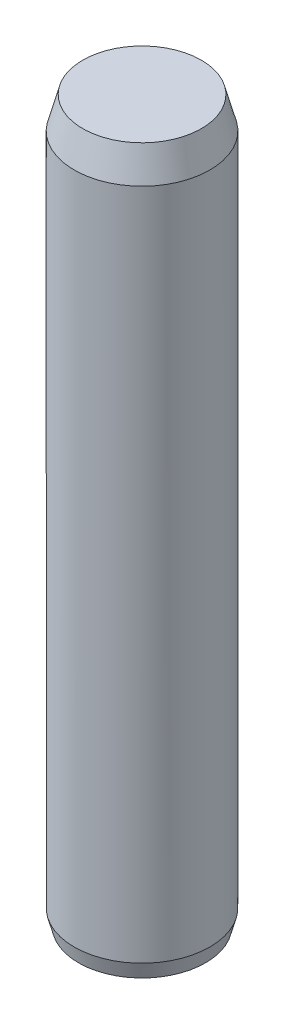
ISO-10303-21;
HEADER;
FILE_DESCRIPTION(('STEP AP214'),'2;1');
FILE_NAME('part.step','',(''),(''),'','','');
FILE_SCHEMA(('AUTOMOTIVE_DESIGN { 1 0 10303 214 1 1 1 1 }'));
ENDSEC;
DATA;
#1=APPLICATION_CONTEXT('core data for automotive mechanical design processes');
#2=APPLICATION_PROTOCOL_DEFINITION('international standard','automotive_design',2000,#1);
#3=PRODUCT_CONTEXT('',#1,'mechanical');
#4=PRODUCT('Part','Part','',(#3));
#5=PRODUCT_RELATED_PRODUCT_CATEGORY('part','',(#4));
#6=PRODUCT_DEFINITION_FORMATION('','',#4);
#7=PRODUCT_DEFINITION_CONTEXT('part definition',#1,'design');
#8=PRODUCT_DEFINITION('design','',#6,#7);
#9=PRODUCT_DEFINITION_SHAPE('','',#8);
#10=(LENGTH_UNIT() NAMED_UNIT(*) SI_UNIT(.MILLI.,.METRE.));
#11=(NAMED_UNIT(*) PLANE_ANGLE_UNIT() SI_UNIT($,.RADIAN.));
#12=(NAMED_UNIT(*) SI_UNIT($,.STERADIAN.) SOLID_ANGLE_UNIT());
#13=UNCERTAINTY_MEASURE_WITH_UNIT(LENGTH_MEASURE(1.E-05),#10,'distance_accuracy_value','');
#14=(GEOMETRIC_REPRESENTATION_CONTEXT(3) GLOBAL_UNCERTAINTY_ASSIGNED_CONTEXT((#13)) GLOBAL_UNIT_ASSIGNED_CONTEXT((#10,
#11,#12)) REPRESENTATION_CONTEXT('',''));
#15=CARTESIAN_POINT('',(0.,0.,0.));
#16=DIRECTION('',(0.,0.,1.));
#17=DIRECTION('',(1.,0.,0.));
#18=AXIS2_PLACEMENT_3D('',#15,#16,#17);
#19=CARTESIAN_POINT('',(0.,170.,0.));
#20=DIRECTION('',(0.,-1.,0.));
#21=DIRECTION('',(0.,0.,-1.));
#22=AXIS2_PLACEMENT_3D('',#19,#20,#21);
#23=CYLINDRICAL_SURFACE('',#22,16.);
#24=CARTESIAN_POINT('',(0.,3.73205080756891,0.));
#25=DIRECTION('',(0.,1.,0.));
#26=DIRECTION('',(0.,0.,1.));
#27=AXIS2_PLACEMENT_3D('',#24,#25,#26);
#28=CIRCLE('',#27,16.);
#29=CARTESIAN_POINT('',(0.,3.73205080756891,-16.));
#30=VERTEX_POINT('',#29);
#31=EDGE_CURVE('E47',#30,#30,#28,.T.);
#32=CARTESIAN_POINT('',(0.,162.535898384862,0.));
#33=DIRECTION('',(0.,1.,0.));
#34=DIRECTION('',(0.,0.,1.));
#35=AXIS2_PLACEMENT_3D('',#32,#33,#34);
#36=CIRCLE('',#35,16.);
#37=CARTESIAN_POINT('',(0.,162.535898384862,-16.));
#38=VERTEX_POINT('',#37);
#39=EDGE_CURVE('E51',#38,#38,#36,.F.);
#40=CARTESIAN_POINT('',(0.,3.73205080756891,-16.));
#41=CARTESIAN_POINT('',(0.,5.38625755316572,-16.));
#42=CARTESIAN_POINT('',(0.,7.04046429876253,-16.));
#43=CARTESIAN_POINT('',(0.,10.3488777899561,-16.));
#44=CARTESIAN_POINT('',(0.,12.003084535553,-16.));
#45=CARTESIAN_POINT('',(0.,15.3114980267466,-16.));
#46=CARTESIAN_POINT('',(0.,16.9657047723434,-16.));
#47=CARTESIAN_POINT('',(0.,20.274118263537,-16.));
#48=CARTESIAN_POINT('',(0.,21.9283250091338,-16.));
#49=CARTESIAN_POINT('',(0.,25.2367385003274,-16.));
#50=CARTESIAN_POINT('',(0.,26.8909452459242,-16.));
#51=CARTESIAN_POINT('',(0.,30.1993587371178,-16.));
#52=CARTESIAN_POINT('',(0.,31.8535654827146,-16.));
#53=CARTESIAN_POINT('',(0.,35.1619789739082,-16.));
#54=CARTESIAN_POINT('',(0.,36.816185719505,-16.));
#55=CARTESIAN_POINT('',(0.,40.1245992106986,-16.));
#56=CARTESIAN_POINT('',(0.,41.7788059562955,-16.));
#57=CARTESIAN_POINT('',(0.,45.0872194474891,-16.));
#58=CARTESIAN_POINT('',(0.,46.7414261930859,-16.));
#59=CARTESIAN_POINT('',(0.,50.0498396842795,-16.));
#60=CARTESIAN_POINT('',(0.,51.7040464298763,-16.));
#61=CARTESIAN_POINT('',(0.,55.0124599210699,-16.));
#62=CARTESIAN_POINT('',(0.,56.6666666666667,-16.));
#63=CARTESIAN_POINT('',(0.,59.9750801578603,-16.));
#64=CARTESIAN_POINT('',(0.,61.6292869034571,-16.));
#65=CARTESIAN_POINT('',(0.,64.9377003946507,-16.));
#66=CARTESIAN_POINT('',(0.,66.5919071402475,-16.));
#67=CARTESIAN_POINT('',(0.,69.9003206314411,-16.));
#68=CARTESIAN_POINT('',(0.,71.554527377038,-16.));
#69=CARTESIAN_POINT('',(0.,74.8629408682316,-16.));
#70=CARTESIAN_POINT('',(0.,76.5171476138284,-16.));
#71=CARTESIAN_POINT('',(0.,79.825561105022,-16.));
#72=CARTESIAN_POINT('',(0.,81.4797678506188,-16.));
#73=CARTESIAN_POINT('',(0.,84.7881813418124,-16.));
#74=CARTESIAN_POINT('',(0.,86.4423880874092,-16.));
#75=CARTESIAN_POINT('',(0.,89.7508015786028,-16.));
#76=CARTESIAN_POINT('',(0.,91.4050083241996,-16.));
#77=CARTESIAN_POINT('',(0.,94.7134218153932,-16.));
#78=CARTESIAN_POINT('',(0.,96.3676285609901,-16.));
#79=CARTESIAN_POINT('',(0.,99.6760420521837,-16.));
#80=CARTESIAN_POINT('',(0.,101.33024879778,-16.));
#81=CARTESIAN_POINT('',(0.,104.638662288974,-16.));
#82=CARTESIAN_POINT('',(0.,106.292869034571,-16.));
#83=CARTESIAN_POINT('',(0.,109.601282525764,-16.));
#84=CARTESIAN_POINT('',(0.,111.255489271361,-16.));
#85=CARTESIAN_POINT('',(0.,114.563902762555,-16.));
#86=CARTESIAN_POINT('',(0.,116.218109508152,-16.));
#87=CARTESIAN_POINT('',(0.,119.526522999345,-16.));
#88=CARTESIAN_POINT('',(0.,121.180729744942,-16.));
#89=CARTESIAN_POINT('',(0.,124.489143236136,-16.));
#90=CARTESIAN_POINT('',(0.,126.143349981733,-16.));
#91=CARTESIAN_POINT('',(0.,129.451763472926,-16.));
#92=CARTESIAN_POINT('',(0.,131.105970218523,-16.));
#93=CARTESIAN_POINT('',(0.,134.414383709717,-16.));
#94=CARTESIAN_POINT('',(0.,136.068590455313,-16.));
#95=CARTESIAN_POINT('',(0.,139.377003946507,-16.));
#96=CARTESIAN_POINT('',(0.,141.031210692104,-16.));
#97=CARTESIAN_POINT('',(0.,144.339624183297,-16.));
#98=CARTESIAN_POINT('',(0.,145.993830928894,-16.));
#99=CARTESIAN_POINT('',(0.,149.302244420088,-16.));
#100=CARTESIAN_POINT('',(0.,150.956451165685,-16.));
#101=CARTESIAN_POINT('',(0.,154.264864656878,-16.));
#102=CARTESIAN_POINT('',(0.,155.919071402475,-16.));
#103=CARTESIAN_POINT('',(0.,159.227484893669,-16.));
#104=CARTESIAN_POINT('',(0.,160.881691639265,-16.));
#105=CARTESIAN_POINT('',(0.,162.535898384862,-16.));
#106=B_SPLINE_CURVE_WITH_KNOTS('',3,(#40,#41,#42,#43,#44,#45,#46,#47,#48,#49,#50,#51,#52,#53,
#54,#55,#56,#57,#58,#59,#60,#61,#62,#63,#64,#65,#66,#67,#68,#69,#70,#71,#72,#73,#74,#75,#76,#77,
#78,#79,#80,#81,#82,#83,#84,#85,#86,#87,#88,#89,#90,#91,#92,#93,#94,#95,#96,#97,#98,#99,#100,
#101,#102,#103,#104,#105),.UNSPECIFIED.,.F.,.F.,(4,2,2,2,2,2,2,2,2,2,2,2,2,2,2,2,2,2,2,2,2,2,2,
2,2,2,2,2,2,2,2,2,4),(0.,4.96262023679042,9.92524047358084,14.8878607103713,19.8504809471617,
24.8131011839521,29.7757214207425,34.7383416575329,39.7009618943233,44.6635821311138,
49.6262023679042,54.5888226046946,59.551442841485,64.5140630782754,69.4766833150658,
74.4393035518563,79.4019237886467,84.3645440254371,89.3271642622275,94.2897844990179,
99.2524047358084,104.215024972599,109.177645209389,114.14026544618,119.10288568297,
124.06550591976,129.028126156551,133.990746393341,138.953366630132,143.915986866922,
148.878607103713,153.841227340503,158.803847577293),.UNSPECIFIED.);
#107=EDGE_CURVE('BSEAM39',#30,#38,#106,.T.);
#108=ORIENTED_EDGE('',*,*,#31,.T.);
#109=ORIENTED_EDGE('',*,*,#39,.T.);
#110=ORIENTED_EDGE('',*,*,#107,.T.);
#111=ORIENTED_EDGE('',*,*,#107,.F.);
#112=EDGE_LOOP('',(#108,#110,#109,#111));
#113=FACE_BOUND('',#112,.T.);
#114=ADVANCED_FACE('F39',(#113),#23,.T.);
#115=CARTESIAN_POINT('',(0.,170.,0.));
#116=DIRECTION('',(0.,1.,0.));
#117=DIRECTION('',(0.,0.,1.));
#118=AXIS2_PLACEMENT_3D('',#115,#116,#117);
#119=PLANE('',#118);
#120=CARTESIAN_POINT('',(0.,170.,0.));
#121=DIRECTION('',(0.,1.,0.));
#122=DIRECTION('',(0.,0.,1.));
#123=AXIS2_PLACEMENT_3D('',#120,#121,#122);
#124=CIRCLE('',#123,14.);
#125=CARTESIAN_POINT('',(0.,170.,-14.));
#126=VERTEX_POINT('',#125);
#127=EDGE_CURVE('E55',#126,#126,#124,.T.);
#128=ORIENTED_EDGE('',*,*,#127,.T.);
#129=EDGE_LOOP('',(#128));
#130=FACE_BOUND('',#129,.T.);
#131=ADVANCED_FACE('F61',(#130),#119,.T.);
#132=CARTESIAN_POINT('',(0.,0.,0.));
#133=DIRECTION('',(0.,1.,0.));
#134=DIRECTION('',(0.,0.,1.));
#135=AXIS2_PLACEMENT_3D('',#132,#133,#134);
#136=PLANE('',#135);
#137=CARTESIAN_POINT('',(0.,0.,0.));
#138=DIRECTION('',(0.,1.,0.));
#139=DIRECTION('',(0.,0.,1.));
#140=AXIS2_PLACEMENT_3D('',#137,#138,#139);
#141=CIRCLE('',#140,15.);
#142=CARTESIAN_POINT('',(0.,0.,15.));
#143=VERTEX_POINT('',#142);
#144=EDGE_CURVE('E10',#143,#143,#141,.F.);
#145=ORIENTED_EDGE('',*,*,#144,.T.);
#146=EDGE_LOOP('',(#145));
#147=FACE_BOUND('',#146,.T.);
#148=ADVANCED_FACE('F65',(#147),#136,.F.);
#149=CARTESIAN_POINT('',(0.,170.,0.));
#150=DIRECTION('',(0.,-1.,0.));
#151=DIRECTION('',(0.,0.,-1.));
#152=AXIS2_PLACEMENT_3D('',#149,#150,#151);
#153=CONICAL_SURFACE('',#152,14.,0.261799387799147);
#154=CARTESIAN_POINT('',(0.,162.535898384862,-16.));
#155=CARTESIAN_POINT('',(0.,162.613649443353,-15.9791666666667));
#156=CARTESIAN_POINT('',(0.,162.691400501844,-15.9583333333333));
#157=CARTESIAN_POINT('',(0.,162.846902618826,-15.9166666666667));
#158=CARTESIAN_POINT('',(0.,162.924653677317,-15.8958333333333));
#159=CARTESIAN_POINT('',(0.,163.080155794299,-15.8541666666667));
#160=CARTESIAN_POINT('',(0.,163.15790685279,-15.8333333333333));
#161=CARTESIAN_POINT('',(0.,163.313408969772,-15.7916666666667));
#162=CARTESIAN_POINT('',(0.,163.391160028263,-15.7708333333333));
#163=CARTESIAN_POINT('',(0.,163.546662145246,-15.7291666666667));
#164=CARTESIAN_POINT('',(0.,163.624413203737,-15.7083333333333));
#165=CARTESIAN_POINT('',(0.,163.779915320719,-15.6666666666667));
#166=CARTESIAN_POINT('',(0.,163.85766637921,-15.6458333333333));
#167=CARTESIAN_POINT('',(0.,164.013168496192,-15.6041666666667));
#168=CARTESIAN_POINT('',(0.,164.090919554683,-15.5833333333333));
#169=CARTESIAN_POINT('',(0.,164.246421671665,-15.5416666666667));
#170=CARTESIAN_POINT('',(0.,164.324172730156,-15.5208333333333));
#171=CARTESIAN_POINT('',(0.,164.479674847138,-15.4791666666667));
#172=CARTESIAN_POINT('',(0.,164.557425905629,-15.4583333333333));
#173=CARTESIAN_POINT('',(0.,164.712928022611,-15.4166666666667));
#174=CARTESIAN_POINT('',(0.,164.790679081102,-15.3958333333333));
#175=CARTESIAN_POINT('',(0.,164.946181198084,-15.3541666666667));
#176=CARTESIAN_POINT('',(0.,165.023932256575,-15.3333333333333));
#177=CARTESIAN_POINT('',(0.,165.179434373557,-15.2916666666667));
#178=CARTESIAN_POINT('',(0.,165.257185432048,-15.2708333333333));
#179=CARTESIAN_POINT('',(0.,165.41268754903,-15.2291666666667));
#180=CARTESIAN_POINT('',(0.,165.490438607521,-15.2083333333333));
#181=CARTESIAN_POINT('',(0.,165.645940724503,-15.1666666666667));
#182=CARTESIAN_POINT('',(0.,165.723691782994,-15.1458333333333));
#183=CARTESIAN_POINT('',(0.,165.879193899976,-15.1041666666667));
#184=CARTESIAN_POINT('',(0.,165.956944958467,-15.0833333333333));
#185=CARTESIAN_POINT('',(0.,166.112447075449,-15.0416666666667));
#186=CARTESIAN_POINT('',(0.,166.19019813394,-15.0208333333334));
#187=CARTESIAN_POINT('',(0.,166.345700250922,-14.9791666666667));
#188=CARTESIAN_POINT('',(0.,166.423451309413,-14.9583333333334));
#189=CARTESIAN_POINT('',(0.,166.578953426395,-14.9166666666667));
#190=CARTESIAN_POINT('',(0.,166.656704484886,-14.8958333333333));
#191=CARTESIAN_POINT('',(0.,166.812206601868,-14.8541666666667));
#192=CARTESIAN_POINT('',(0.,166.889957660359,-14.8333333333334));
#193=CARTESIAN_POINT('',(0.,167.045459777341,-14.7916666666667));
#194=CARTESIAN_POINT('',(0.,167.123210835832,-14.7708333333334));
#195=CARTESIAN_POINT('',(0.,167.278712952814,-14.7291666666667));
#196=CARTESIAN_POINT('',(0.,167.356464011305,-14.7083333333334));
#197=CARTESIAN_POINT('',(0.,167.511966128287,-14.6666666666667));
#198=CARTESIAN_POINT('',(0.,167.589717186778,-14.6458333333334));
#199=CARTESIAN_POINT('',(0.,167.74521930376,-14.6041666666667));
#200=CARTESIAN_POINT('',(0.,167.822970362251,-14.5833333333334));
#201=CARTESIAN_POINT('',(0.,167.978472479234,-14.5416666666667));
#202=CARTESIAN_POINT('',(0.,168.056223537725,-14.5208333333334));
#203=CARTESIAN_POINT('',(0.,168.211725654707,-14.4791666666667));
#204=CARTESIAN_POINT('',(0.,168.289476713198,-14.4583333333334));
#205=CARTESIAN_POINT('',(0.,168.44497883018,-14.4166666666667));
#206=CARTESIAN_POINT('',(0.,168.522729888671,-14.3958333333334));
#207=CARTESIAN_POINT('',(0.,168.678232005653,-14.3541666666667));
#208=CARTESIAN_POINT('',(0.,168.755983064144,-14.3333333333334));
#209=CARTESIAN_POINT('',(0.,168.911485181126,-14.2916666666667));
#210=CARTESIAN_POINT('',(0.,168.989236239617,-14.2708333333334));
#211=CARTESIAN_POINT('',(0.,169.144738356599,-14.2291666666667));
#212=CARTESIAN_POINT('',(0.,169.22248941509,-14.2083333333334));
#213=CARTESIAN_POINT('',(0.,169.377991532072,-14.1666666666667));
#214=CARTESIAN_POINT('',(0.,169.455742590563,-14.1458333333334));
#215=CARTESIAN_POINT('',(0.,169.611244707545,-14.1041666666667));
#216=CARTESIAN_POINT('',(0.,169.688995766036,-14.0833333333334));
#217=CARTESIAN_POINT('',(0.,169.844497883018,-14.0416666666667));
#218=CARTESIAN_POINT('',(0.,169.922248941509,-14.0208333333334));
#219=CARTESIAN_POINT('',(0.,170.,-14.));
#220=B_SPLINE_CURVE_WITH_KNOTS('',3,(#154,#155,#156,#157,#158,#159,#160,#161,#162,#163,#164,
#165,#166,#167,#168,#169,#170,#171,#172,#173,#174,#175,#176,#177,#178,#179,#180,#181,#182,#183,
#184,#185,#186,#187,#188,#189,#190,#191,#192,#193,#194,#195,#196,#197,#198,#199,#200,#201,#202,
#203,#204,#205,#206,#207,#208,#209,#210,#211,#212,#213,#214,#215,#216,#217,#218,#219),
.UNSPECIFIED.,.F.,.F.,(4,2,2,2,2,2,2,2,2,2,2,2,2,2,2,2,2,2,2,2,2,2,2,2,2,2,2,2,2,2,2,2,4),(0.,
0.241481456572254,0.482962913144508,0.724444369716789,0.965925826289043,1.20740728286132,
1.44888873943358,1.69037019600586,1.93185165257811,2.17333310915037,2.41481456572265,
2.6562960222949,2.89777747886718,3.13925893543944,3.38074039201172,3.62222184858397,
3.86370330515625,4.10518476172851,4.34666621830076,4.58814767487304,4.8296291314453,
5.07111058801758,5.31259204458983,5.55407350116211,5.79555495773437,6.03703641430662,
6.2785178708789,6.51999932745115,6.76148078402344,7.00296224059569,7.24444369716797,
7.48592515374022,7.7274066103125),.UNSPECIFIED.);
#221=EDGE_CURVE('BSEAM63',#38,#126,#220,.T.);
#222=ORIENTED_EDGE('',*,*,#39,.F.);
#223=ORIENTED_EDGE('',*,*,#127,.F.);
#224=ORIENTED_EDGE('',*,*,#221,.T.);
#225=ORIENTED_EDGE('',*,*,#221,.F.);
#226=EDGE_LOOP('',(#222,#224,#223,#225));
#227=FACE_BOUND('',#226,.T.);
#228=ADVANCED_FACE('F63',(#227),#153,.T.);
#229=CARTESIAN_POINT('',(0.,3.73205080756891,0.));
#230=DIRECTION('',(0.,1.,0.));
#231=DIRECTION('',(0.,0.,1.));
#232=AXIS2_PLACEMENT_3D('',#229,#230,#231);
#233=CONICAL_SURFACE('',#232,16.,0.261799387799151);
#234=ORIENTED_EDGE('',*,*,#144,.F.);
#235=EDGE_LOOP('',(#234));
#236=FACE_BOUND('',#235,.T.);
#237=ORIENTED_EDGE('',*,*,#31,.F.);
#238=EDGE_LOOP('',(#237));
#239=FACE_BOUND('',#238,.T.);
#240=ADVANCED_FACE('F42',(#236,#239),#233,.T.);
#241=CLOSED_SHELL('',(#114,#131,#148,#228,#240));
#242=MANIFOLD_SOLID_BREP('B2',#241);
#243=ADVANCED_BREP_SHAPE_REPRESENTATION('',(#18,#242),#14);
#244=SHAPE_DEFINITION_REPRESENTATION(#9,#243);
ENDSEC;
END-ISO-10303-21;
